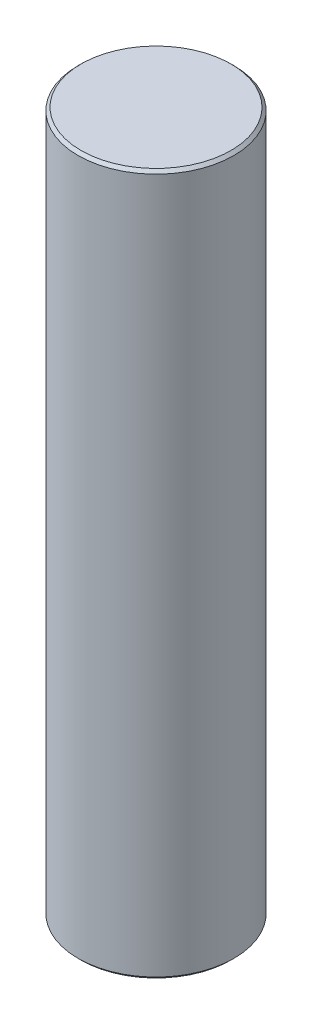
ISO-10303-21;
HEADER;
FILE_DESCRIPTION(('STEP AP214'),'2;1');
FILE_NAME('part.step','',(''),(''),'','','');
FILE_SCHEMA(('AUTOMOTIVE_DESIGN { 1 0 10303 214 1 1 1 1 }'));
ENDSEC;
DATA;
#1=APPLICATION_CONTEXT('core data for automotive mechanical design processes');
#2=APPLICATION_PROTOCOL_DEFINITION('international standard','automotive_design',2000,#1);
#3=PRODUCT_CONTEXT('',#1,'mechanical');
#4=PRODUCT('Part','Part','',(#3));
#5=PRODUCT_RELATED_PRODUCT_CATEGORY('part','',(#4));
#6=PRODUCT_DEFINITION_FORMATION('','',#4);
#7=PRODUCT_DEFINITION_CONTEXT('part definition',#1,'design');
#8=PRODUCT_DEFINITION('design','',#6,#7);
#9=PRODUCT_DEFINITION_SHAPE('','',#8);
#10=(LENGTH_UNIT() NAMED_UNIT(*) SI_UNIT(.MILLI.,.METRE.));
#11=(NAMED_UNIT(*) PLANE_ANGLE_UNIT() SI_UNIT($,.RADIAN.));
#12=(NAMED_UNIT(*) SI_UNIT($,.STERADIAN.) SOLID_ANGLE_UNIT());
#13=UNCERTAINTY_MEASURE_WITH_UNIT(LENGTH_MEASURE(1.E-05),#10,'distance_accuracy_value','');
#14=(GEOMETRIC_REPRESENTATION_CONTEXT(3) GLOBAL_UNCERTAINTY_ASSIGNED_CONTEXT((#13)) GLOBAL_UNIT_ASSIGNED_CONTEXT((#10,
#11,#12)) REPRESENTATION_CONTEXT('',''));
#15=CARTESIAN_POINT('',(0.,0.,0.));
#16=DIRECTION('',(0.,0.,1.));
#17=DIRECTION('',(1.,0.,0.));
#18=AXIS2_PLACEMENT_3D('',#15,#16,#17);
#19=CARTESIAN_POINT('',(0.,36.,0.));
#20=DIRECTION('',(0.,-1.,0.));
#21=DIRECTION('',(0.,0.,-1.));
#22=AXIS2_PLACEMENT_3D('',#19,#20,#21);
#23=CYLINDRICAL_SURFACE('',#22,4.);
#24=CARTESIAN_POINT('',(0.,0.14999999999999,0.));
#25=DIRECTION('',(0.,1.,0.));
#26=DIRECTION('',(0.,0.,1.));
#27=AXIS2_PLACEMENT_3D('',#24,#25,#26);
#28=CIRCLE('',#27,4.);
#29=CARTESIAN_POINT('',(0.,0.14999999999999,4.));
#30=VERTEX_POINT('',#29);
#31=EDGE_CURVE('E45',#30,#30,#28,.T.);
#32=ORIENTED_EDGE('',*,*,#31,.T.);
#33=EDGE_LOOP('',(#32));
#34=FACE_BOUND('',#33,.T.);
#35=CARTESIAN_POINT('',(0.,35.85,0.));
#36=DIRECTION('',(0.,1.,0.));
#37=DIRECTION('',(0.,0.,1.));
#38=AXIS2_PLACEMENT_3D('',#35,#36,#37);
#39=CIRCLE('',#38,4.);
#40=CARTESIAN_POINT('',(0.,35.85,4.));
#41=VERTEX_POINT('',#40);
#42=EDGE_CURVE('E49',#41,#41,#39,.F.);
#43=ORIENTED_EDGE('',*,*,#42,.T.);
#44=EDGE_LOOP('',(#43));
#45=FACE_BOUND('',#44,.T.);
#46=ADVANCED_FACE('F33',(#34,#45),#23,.T.);
#47=CARTESIAN_POINT('',(0.,36.,0.));
#48=DIRECTION('',(0.,1.,0.));
#49=DIRECTION('',(0.,0.,1.));
#50=AXIS2_PLACEMENT_3D('',#47,#48,#49);
#51=PLANE('',#50);
#52=CARTESIAN_POINT('',(0.,36.,0.));
#53=DIRECTION('',(0.,1.,0.));
#54=DIRECTION('',(0.,0.,1.));
#55=AXIS2_PLACEMENT_3D('',#52,#53,#54);
#56=CIRCLE('',#55,3.85);
#57=CARTESIAN_POINT('',(0.,36.,3.85));
#58=VERTEX_POINT('',#57);
#59=EDGE_CURVE('E10',#58,#58,#56,.T.);
#60=ORIENTED_EDGE('',*,*,#59,.T.);
#61=EDGE_LOOP('',(#60));
#62=FACE_BOUND('',#61,.T.);
#63=ADVANCED_FACE('F65',(#62),#51,.T.);
#64=CARTESIAN_POINT('',(0.,0.,0.));
#65=DIRECTION('',(0.,1.,0.));
#66=DIRECTION('',(0.,0.,1.));
#67=AXIS2_PLACEMENT_3D('',#64,#65,#66);
#68=PLANE('',#67);
#69=CARTESIAN_POINT('',(0.,0.,0.));
#70=DIRECTION('',(0.,1.,0.));
#71=DIRECTION('',(0.,0.,1.));
#72=AXIS2_PLACEMENT_3D('',#69,#70,#71);
#73=CIRCLE('',#72,3.85000000000001);
#74=CARTESIAN_POINT('',(0.,0.,3.85000000000001));
#75=VERTEX_POINT('',#74);
#76=EDGE_CURVE('E41',#75,#75,#73,.F.);
#77=ORIENTED_EDGE('',*,*,#76,.T.);
#78=EDGE_LOOP('',(#77));
#79=FACE_BOUND('',#78,.T.);
#80=ADVANCED_FACE('F62',(#79),#68,.F.);
#81=CARTESIAN_POINT('',(0.,0.14999999999999,0.));
#82=DIRECTION('',(0.,1.,0.));
#83=DIRECTION('',(0.,0.,1.));
#84=AXIS2_PLACEMENT_3D('',#81,#82,#83);
#85=CONICAL_SURFACE('',#84,4.,0.78539816339746);
#86=ORIENTED_EDGE('',*,*,#76,.F.);
#87=EDGE_LOOP('',(#86));
#88=FACE_BOUND('',#87,.T.);
#89=ORIENTED_EDGE('',*,*,#31,.F.);
#90=EDGE_LOOP('',(#89));
#91=FACE_BOUND('',#90,.T.);
#92=ADVANCED_FACE('F58',(#88,#91),#85,.T.);
#93=CARTESIAN_POINT('',(0.,36.,0.));
#94=DIRECTION('',(0.,-1.,0.));
#95=DIRECTION('',(0.,0.,-1.));
#96=AXIS2_PLACEMENT_3D('',#93,#94,#95);
#97=CONICAL_SURFACE('',#96,3.85,0.785398163397448);
#98=ORIENTED_EDGE('',*,*,#42,.F.);
#99=EDGE_LOOP('',(#98));
#100=FACE_BOUND('',#99,.T.);
#101=ORIENTED_EDGE('',*,*,#59,.F.);
#102=EDGE_LOOP('',(#101));
#103=FACE_BOUND('',#102,.T.);
#104=ADVANCED_FACE('F36',(#100,#103),#97,.T.);
#105=CLOSED_SHELL('',(#46,#63,#80,#92,#104));
#106=MANIFOLD_SOLID_BREP('B2',#105);
#107=ADVANCED_BREP_SHAPE_REPRESENTATION('',(#18,#106),#14);
#108=SHAPE_DEFINITION_REPRESENTATION(#9,#107);
ENDSEC;
END-ISO-10303-21;
